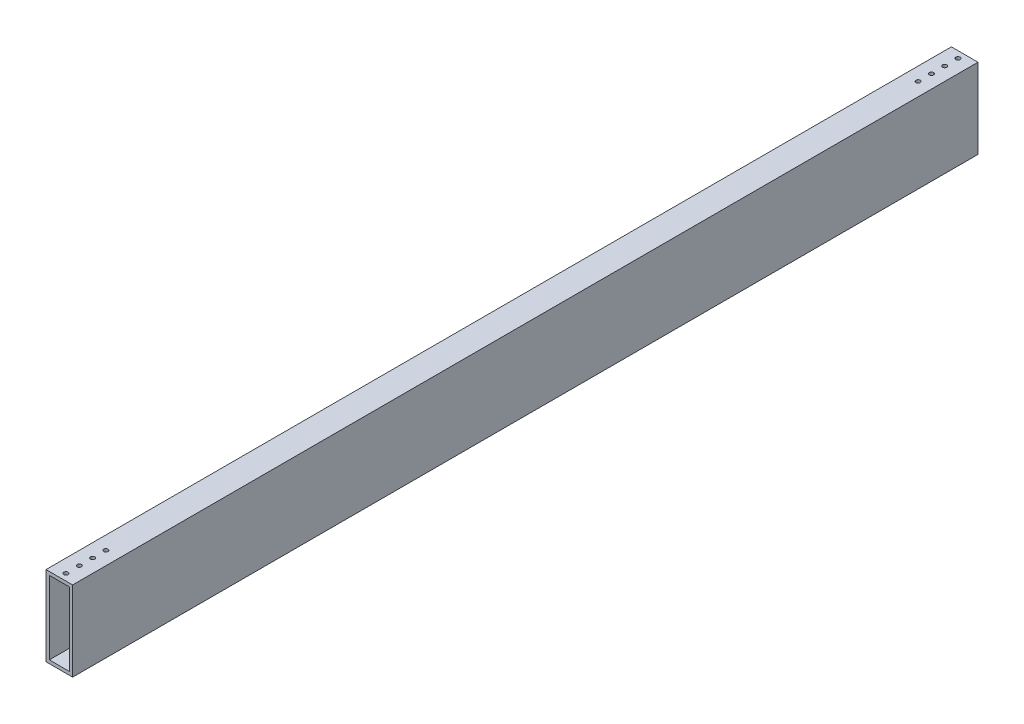
ISO-10303-21;
HEADER;
FILE_DESCRIPTION(('STEP AP214'),'2;1');
FILE_NAME('part.step','',(''),(''),'','','');
FILE_SCHEMA(('AUTOMOTIVE_DESIGN { 1 0 10303 214 1 1 1 1 }'));
ENDSEC;
DATA;
#1=APPLICATION_CONTEXT('core data for automotive mechanical design processes');
#2=APPLICATION_PROTOCOL_DEFINITION('international standard','automotive_design',2000,#1);
#3=PRODUCT_CONTEXT('',#1,'mechanical');
#4=PRODUCT('Part','Part','',(#3));
#5=PRODUCT_RELATED_PRODUCT_CATEGORY('part','',(#4));
#6=PRODUCT_DEFINITION_FORMATION('','',#4);
#7=PRODUCT_DEFINITION_CONTEXT('part definition',#1,'design');
#8=PRODUCT_DEFINITION('design','',#6,#7);
#9=PRODUCT_DEFINITION_SHAPE('','',#8);
#10=(LENGTH_UNIT() NAMED_UNIT(*) SI_UNIT(.MILLI.,.METRE.));
#11=(NAMED_UNIT(*) PLANE_ANGLE_UNIT() SI_UNIT($,.RADIAN.));
#12=(NAMED_UNIT(*) SI_UNIT($,.STERADIAN.) SOLID_ANGLE_UNIT());
#13=UNCERTAINTY_MEASURE_WITH_UNIT(LENGTH_MEASURE(1.E-05),#10,'distance_accuracy_value','');
#14=(GEOMETRIC_REPRESENTATION_CONTEXT(3) GLOBAL_UNCERTAINTY_ASSIGNED_CONTEXT((#13)) GLOBAL_UNIT_ASSIGNED_CONTEXT((#10,
#11,#12)) REPRESENTATION_CONTEXT('',''));
#15=CARTESIAN_POINT('',(0.,0.,0.));
#16=DIRECTION('',(0.,0.,1.));
#17=DIRECTION('',(1.,0.,0.));
#18=AXIS2_PLACEMENT_3D('',#15,#16,#17);
#19=CARTESIAN_POINT('',(3.9907631702977E-13,33.02,387.35));
#20=DIRECTION('',(0.,1.,0.));
#21=DIRECTION('',(0.,0.,1.));
#22=AXIS2_PLACEMENT_3D('',#19,#20,#21);
#23=CYLINDRICAL_SURFACE('',#22,2.0193);
#24=CARTESIAN_POINT('',(3.9907631702977E-13,34.925,387.35));
#25=DIRECTION('',(0.,1.,0.));
#26=DIRECTION('',(0.,0.,1.));
#27=AXIS2_PLACEMENT_3D('',#24,#25,#26);
#28=CIRCLE('',#27,2.0193);
#29=CARTESIAN_POINT('',(3.9907631702977E-13,34.925,389.3693));
#30=VERTEX_POINT('',#29);
#31=EDGE_CURVE('E20',#30,#30,#28,.T.);
#32=ORIENTED_EDGE('',*,*,#31,.F.);
#33=EDGE_LOOP('',(#32));
#34=FACE_BOUND('',#33,.T.);
#35=CARTESIAN_POINT('',(3.9907631702977E-13,38.1,387.35));
#36=DIRECTION('',(0.,1.,0.));
#37=DIRECTION('',(0.,0.,1.));
#38=AXIS2_PLACEMENT_3D('',#35,#36,#37);
#39=CIRCLE('',#38,2.0193);
#40=CARTESIAN_POINT('',(3.9907631702977E-13,38.1,389.3693));
#41=VERTEX_POINT('',#40);
#42=EDGE_CURVE('E117',#41,#41,#39,.T.);
#43=ORIENTED_EDGE('',*,*,#42,.T.);
#44=EDGE_LOOP('',(#43));
#45=FACE_BOUND('',#44,.T.);
#46=ADVANCED_FACE('F17',(#34,#45),#23,.F.);
#47=CARTESIAN_POINT('',(2.66050878019847E-13,33.02,400.05));
#48=DIRECTION('',(0.,1.,0.));
#49=DIRECTION('',(0.,0.,1.));
#50=AXIS2_PLACEMENT_3D('',#47,#48,#49);
#51=CYLINDRICAL_SURFACE('',#50,2.0193);
#52=CARTESIAN_POINT('',(2.66050878019847E-13,34.925,400.05));
#53=DIRECTION('',(0.,1.,0.));
#54=DIRECTION('',(0.,0.,1.));
#55=AXIS2_PLACEMENT_3D('',#52,#53,#54);
#56=CIRCLE('',#55,2.0193);
#57=CARTESIAN_POINT('',(2.66050878019847E-13,34.925,402.0693));
#58=VERTEX_POINT('',#57);
#59=EDGE_CURVE('E161',#58,#58,#56,.T.);
#60=ORIENTED_EDGE('',*,*,#59,.F.);
#61=EDGE_LOOP('',(#60));
#62=FACE_BOUND('',#61,.T.);
#63=CARTESIAN_POINT('',(2.66050878019847E-13,38.1,400.05));
#64=DIRECTION('',(0.,1.,0.));
#65=DIRECTION('',(0.,0.,1.));
#66=AXIS2_PLACEMENT_3D('',#63,#64,#65);
#67=CIRCLE('',#66,2.0193);
#68=CARTESIAN_POINT('',(2.66050878019847E-13,38.1,402.0693));
#69=VERTEX_POINT('',#68);
#70=EDGE_CURVE('E140',#69,#69,#67,.T.);
#71=ORIENTED_EDGE('',*,*,#70,.T.);
#72=EDGE_LOOP('',(#71));
#73=FACE_BOUND('',#72,.T.);
#74=ADVANCED_FACE('F171',(#62,#73),#51,.F.);
#75=CARTESIAN_POINT('',(1.33025439009923E-13,33.02,412.75));
#76=DIRECTION('',(0.,1.,0.));
#77=DIRECTION('',(0.,0.,1.));
#78=AXIS2_PLACEMENT_3D('',#75,#76,#77);
#79=CYLINDRICAL_SURFACE('',#78,2.0193);
#80=CARTESIAN_POINT('',(1.33025439009923E-13,34.925,412.75));
#81=DIRECTION('',(0.,1.,0.));
#82=DIRECTION('',(0.,0.,1.));
#83=AXIS2_PLACEMENT_3D('',#80,#81,#82);
#84=CIRCLE('',#83,2.0193);
#85=CARTESIAN_POINT('',(1.33025439009923E-13,34.925,414.7693));
#86=VERTEX_POINT('',#85);
#87=EDGE_CURVE('E159',#86,#86,#84,.T.);
#88=ORIENTED_EDGE('',*,*,#87,.F.);
#89=EDGE_LOOP('',(#88));
#90=FACE_BOUND('',#89,.T.);
#91=CARTESIAN_POINT('',(1.33025439009923E-13,38.1,412.75));
#92=DIRECTION('',(0.,1.,0.));
#93=DIRECTION('',(0.,0.,1.));
#94=AXIS2_PLACEMENT_3D('',#91,#92,#93);
#95=CIRCLE('',#94,2.0193);
#96=CARTESIAN_POINT('',(1.33025439009923E-13,38.1,414.7693));
#97=VERTEX_POINT('',#96);
#98=EDGE_CURVE('E137',#97,#97,#95,.T.);
#99=ORIENTED_EDGE('',*,*,#98,.T.);
#100=EDGE_LOOP('',(#99));
#101=FACE_BOUND('',#100,.T.);
#102=ADVANCED_FACE('F272',(#90,#101),#79,.F.);
#103=CARTESIAN_POINT('',(0.,33.02,425.45));
#104=DIRECTION('',(0.,1.,0.));
#105=DIRECTION('',(0.,0.,1.));
#106=AXIS2_PLACEMENT_3D('',#103,#104,#105);
#107=CYLINDRICAL_SURFACE('',#106,2.0193);
#108=CARTESIAN_POINT('',(0.,34.925,425.45));
#109=DIRECTION('',(0.,1.,0.));
#110=DIRECTION('',(0.,0.,1.));
#111=AXIS2_PLACEMENT_3D('',#108,#109,#110);
#112=CIRCLE('',#111,2.0193);
#113=CARTESIAN_POINT('',(0.,34.925,427.4693));
#114=VERTEX_POINT('',#113);
#115=EDGE_CURVE('E156',#114,#114,#112,.T.);
#116=ORIENTED_EDGE('',*,*,#115,.F.);
#117=EDGE_LOOP('',(#116));
#118=FACE_BOUND('',#117,.T.);
#119=CARTESIAN_POINT('',(0.,38.1,425.45));
#120=DIRECTION('',(0.,1.,0.));
#121=DIRECTION('',(0.,0.,1.));
#122=AXIS2_PLACEMENT_3D('',#119,#120,#121);
#123=CIRCLE('',#122,2.0193);
#124=CARTESIAN_POINT('',(0.,38.1,427.4693));
#125=VERTEX_POINT('',#124);
#126=EDGE_CURVE('E134',#125,#125,#123,.T.);
#127=ORIENTED_EDGE('',*,*,#126,.T.);
#128=EDGE_LOOP('',(#127));
#129=FACE_BOUND('',#128,.T.);
#130=ADVANCED_FACE('F268',(#118,#129),#107,.F.);
#131=CARTESIAN_POINT('',(3.9907631702977E-13,33.02,-387.35));
#132=DIRECTION('',(0.,1.,0.));
#133=DIRECTION('',(0.,0.,1.));
#134=AXIS2_PLACEMENT_3D('',#131,#132,#133);
#135=CYLINDRICAL_SURFACE('',#134,2.0193);
#136=CARTESIAN_POINT('',(3.9907631702977E-13,34.925,-387.35));
#137=DIRECTION('',(0.,1.,0.));
#138=DIRECTION('',(0.,0.,1.));
#139=AXIS2_PLACEMENT_3D('',#136,#137,#138);
#140=CIRCLE('',#139,2.0193);
#141=CARTESIAN_POINT('',(3.9907631702977E-13,34.925,-385.3307));
#142=VERTEX_POINT('',#141);
#143=EDGE_CURVE('E153',#142,#142,#140,.T.);
#144=ORIENTED_EDGE('',*,*,#143,.F.);
#145=EDGE_LOOP('',(#144));
#146=FACE_BOUND('',#145,.T.);
#147=CARTESIAN_POINT('',(3.9907631702977E-13,38.1,-387.35));
#148=DIRECTION('',(0.,1.,0.));
#149=DIRECTION('',(0.,0.,1.));
#150=AXIS2_PLACEMENT_3D('',#147,#148,#149);
#151=CIRCLE('',#150,2.0193);
#152=CARTESIAN_POINT('',(3.9907631702977E-13,38.1,-385.3307));
#153=VERTEX_POINT('',#152);
#154=EDGE_CURVE('E131',#153,#153,#151,.T.);
#155=ORIENTED_EDGE('',*,*,#154,.T.);
#156=EDGE_LOOP('',(#155));
#157=FACE_BOUND('',#156,.T.);
#158=ADVANCED_FACE('F264',(#146,#157),#135,.F.);
#159=CARTESIAN_POINT('',(2.66050878019847E-13,33.02,-400.05));
#160=DIRECTION('',(0.,1.,0.));
#161=DIRECTION('',(0.,0.,1.));
#162=AXIS2_PLACEMENT_3D('',#159,#160,#161);
#163=CYLINDRICAL_SURFACE('',#162,2.0193);
#164=CARTESIAN_POINT('',(2.66050878019847E-13,34.925,-400.05));
#165=DIRECTION('',(0.,1.,0.));
#166=DIRECTION('',(0.,0.,1.));
#167=AXIS2_PLACEMENT_3D('',#164,#165,#166);
#168=CIRCLE('',#167,2.0193);
#169=CARTESIAN_POINT('',(2.66050878019847E-13,34.925,-398.0307));
#170=VERTEX_POINT('',#169);
#171=EDGE_CURVE('E150',#170,#170,#168,.T.);
#172=ORIENTED_EDGE('',*,*,#171,.F.);
#173=EDGE_LOOP('',(#172));
#174=FACE_BOUND('',#173,.T.);
#175=CARTESIAN_POINT('',(2.66050878019847E-13,38.1,-400.05));
#176=DIRECTION('',(0.,1.,0.));
#177=DIRECTION('',(0.,0.,1.));
#178=AXIS2_PLACEMENT_3D('',#175,#176,#177);
#179=CIRCLE('',#178,2.0193);
#180=CARTESIAN_POINT('',(2.66050878019847E-13,38.1,-398.0307));
#181=VERTEX_POINT('',#180);
#182=EDGE_CURVE('E128',#181,#181,#179,.T.);
#183=ORIENTED_EDGE('',*,*,#182,.T.);
#184=EDGE_LOOP('',(#183));
#185=FACE_BOUND('',#184,.T.);
#186=ADVANCED_FACE('F260',(#174,#185),#163,.F.);
#187=CARTESIAN_POINT('',(1.33025439009923E-13,33.02,-412.75));
#188=DIRECTION('',(0.,1.,0.));
#189=DIRECTION('',(0.,0.,1.));
#190=AXIS2_PLACEMENT_3D('',#187,#188,#189);
#191=CYLINDRICAL_SURFACE('',#190,2.0193);
#192=CARTESIAN_POINT('',(1.33025439009923E-13,34.925,-412.75));
#193=DIRECTION('',(0.,1.,0.));
#194=DIRECTION('',(0.,0.,1.));
#195=AXIS2_PLACEMENT_3D('',#192,#193,#194);
#196=CIRCLE('',#195,2.0193);
#197=CARTESIAN_POINT('',(1.33025439009923E-13,34.925,-410.7307));
#198=VERTEX_POINT('',#197);
#199=EDGE_CURVE('E147',#198,#198,#196,.T.);
#200=ORIENTED_EDGE('',*,*,#199,.F.);
#201=EDGE_LOOP('',(#200));
#202=FACE_BOUND('',#201,.T.);
#203=CARTESIAN_POINT('',(1.33025439009923E-13,38.1,-412.75));
#204=DIRECTION('',(0.,1.,0.));
#205=DIRECTION('',(0.,0.,1.));
#206=AXIS2_PLACEMENT_3D('',#203,#204,#205);
#207=CIRCLE('',#206,2.0193);
#208=CARTESIAN_POINT('',(1.33025439009923E-13,38.1,-410.7307));
#209=VERTEX_POINT('',#208);
#210=EDGE_CURVE('E125',#209,#209,#207,.T.);
#211=ORIENTED_EDGE('',*,*,#210,.T.);
#212=EDGE_LOOP('',(#211));
#213=FACE_BOUND('',#212,.T.);
#214=ADVANCED_FACE('F253',(#202,#213),#191,.F.);
#215=CARTESIAN_POINT('',(0.,33.02,-425.45));
#216=DIRECTION('',(0.,1.,0.));
#217=DIRECTION('',(0.,0.,1.));
#218=AXIS2_PLACEMENT_3D('',#215,#216,#217);
#219=CYLINDRICAL_SURFACE('',#218,2.0193);
#220=CARTESIAN_POINT('',(0.,34.925,-425.45));
#221=DIRECTION('',(0.,1.,0.));
#222=DIRECTION('',(0.,0.,1.));
#223=AXIS2_PLACEMENT_3D('',#220,#221,#222);
#224=CIRCLE('',#223,2.0193);
#225=CARTESIAN_POINT('',(0.,34.925,-423.4307));
#226=VERTEX_POINT('',#225);
#227=EDGE_CURVE('E120',#226,#226,#224,.T.);
#228=ORIENTED_EDGE('',*,*,#227,.F.);
#229=EDGE_LOOP('',(#228));
#230=FACE_BOUND('',#229,.T.);
#231=CARTESIAN_POINT('',(0.,38.1,-425.45));
#232=DIRECTION('',(0.,1.,0.));
#233=DIRECTION('',(0.,0.,1.));
#234=AXIS2_PLACEMENT_3D('',#231,#232,#233);
#235=CIRCLE('',#234,2.0193);
#236=CARTESIAN_POINT('',(0.,38.1,-423.4307));
#237=VERTEX_POINT('',#236);
#238=EDGE_CURVE('E116',#237,#237,#235,.T.);
#239=ORIENTED_EDGE('',*,*,#238,.T.);
#240=EDGE_LOOP('',(#239));
#241=FACE_BOUND('',#240,.T.);
#242=ADVANCED_FACE('F245',(#230,#241),#219,.F.);
#243=CARTESIAN_POINT('',(12.7,38.1,431.8));
#244=DIRECTION('',(-1.,0.,0.));
#245=DIRECTION('',(0.,-1.,0.));
#246=AXIS2_PLACEMENT_3D('',#243,#244,#245);
#247=PLANE('',#246);
#248=DIRECTION('',(0.,0.,-1.));
#249=VECTOR('',#248,1.);
#250=CARTESIAN_POINT('',(12.7,38.1,431.8));
#251=LINE('',#250,#249);
#252=CARTESIAN_POINT('',(12.7,38.1,-431.8));
#253=VERTEX_POINT('',#252);
#254=CARTESIAN_POINT('',(12.7,38.1,431.8));
#255=VERTEX_POINT('',#254);
#256=EDGE_CURVE('E113',#253,#255,#251,.F.);
#257=ORIENTED_EDGE('',*,*,#256,.T.);
#258=DIRECTION('',(0.,1.,0.));
#259=VECTOR('',#258,1.);
#260=CARTESIAN_POINT('',(12.7,0.,431.8));
#261=LINE('',#260,#259);
#262=CARTESIAN_POINT('',(12.7,-38.1,431.8));
#263=VERTEX_POINT('',#262);
#264=EDGE_CURVE('E105',#255,#263,#261,.F.);
#265=ORIENTED_EDGE('',*,*,#264,.T.);
#266=DIRECTION('',(0.,0.,1.));
#267=VECTOR('',#266,1.);
#268=CARTESIAN_POINT('',(12.7,-38.1,431.8));
#269=LINE('',#268,#267);
#270=CARTESIAN_POINT('',(12.7,-38.1,-431.8));
#271=VERTEX_POINT('',#270);
#272=EDGE_CURVE('E206',#263,#271,#269,.F.);
#273=ORIENTED_EDGE('',*,*,#272,.T.);
#274=DIRECTION('',(0.,1.,0.));
#275=VECTOR('',#274,1.);
#276=CARTESIAN_POINT('',(12.7,0.,-431.8));
#277=LINE('',#276,#275);
#278=EDGE_CURVE('E239',#253,#271,#277,.F.);
#279=ORIENTED_EDGE('',*,*,#278,.F.);
#280=EDGE_LOOP('',(#257,#265,#273,#279));
#281=FACE_BOUND('',#280,.T.);
#282=ADVANCED_FACE('F242',(#281),#247,.F.);
#283=CARTESIAN_POINT('',(9.525,-34.925,431.8));
#284=DIRECTION('',(0.,1.,0.));
#285=DIRECTION('',(0.,0.,1.));
#286=AXIS2_PLACEMENT_3D('',#283,#284,#285);
#287=PLANE('',#286);
#288=DIRECTION('',(-1.,0.,0.));
#289=VECTOR('',#288,1.);
#290=CARTESIAN_POINT('',(0.,-34.925,431.8));
#291=LINE('',#290,#289);
#292=CARTESIAN_POINT('',(-9.525,-34.925,431.8));
#293=VERTEX_POINT('',#292);
#294=CARTESIAN_POINT('',(9.525,-34.925,431.8));
#295=VERTEX_POINT('',#294);
#296=EDGE_CURVE('E100',#293,#295,#291,.F.);
#297=ORIENTED_EDGE('',*,*,#296,.T.);
#298=DIRECTION('',(0.,0.,1.));
#299=VECTOR('',#298,1.);
#300=CARTESIAN_POINT('',(9.525,-34.925,431.8));
#301=LINE('',#300,#299);
#302=CARTESIAN_POINT('',(9.525,-34.925,-431.8));
#303=VERTEX_POINT('',#302);
#304=EDGE_CURVE('E121',#303,#295,#301,.T.);
#305=ORIENTED_EDGE('',*,*,#304,.F.);
#306=DIRECTION('',(-1.,0.,0.));
#307=VECTOR('',#306,1.);
#308=CARTESIAN_POINT('',(0.,-34.925,-431.8));
#309=LINE('',#308,#307);
#310=CARTESIAN_POINT('',(-9.525,-34.925,-431.8));
#311=VERTEX_POINT('',#310);
#312=EDGE_CURVE('E227',#311,#303,#309,.F.);
#313=ORIENTED_EDGE('',*,*,#312,.F.);
#314=DIRECTION('',(0.,0.,1.));
#315=VECTOR('',#314,1.);
#316=CARTESIAN_POINT('',(-9.525,-34.925,431.8));
#317=LINE('',#316,#315);
#318=EDGE_CURVE('E88',#293,#311,#317,.F.);
#319=ORIENTED_EDGE('',*,*,#318,.F.);
#320=EDGE_LOOP('',(#297,#305,#313,#319));
#321=FACE_BOUND('',#320,.T.);
#322=ADVANCED_FACE('F224',(#321),#287,.T.);
#323=CARTESIAN_POINT('',(9.52499999999999,34.925,431.8));
#324=DIRECTION('',(-1.,0.,0.));
#325=DIRECTION('',(0.,-1.,0.));
#326=AXIS2_PLACEMENT_3D('',#323,#324,#325);
#327=PLANE('',#326);
#328=DIRECTION('',(0.,1.,0.));
#329=VECTOR('',#328,1.);
#330=CARTESIAN_POINT('',(9.525,0.,431.8));
#331=LINE('',#330,#329);
#332=CARTESIAN_POINT('',(9.52499999999999,34.925,431.8));
#333=VERTEX_POINT('',#332);
#334=EDGE_CURVE('E218',#295,#333,#331,.T.);
#335=ORIENTED_EDGE('',*,*,#334,.T.);
#336=DIRECTION('',(0.,0.,-1.));
#337=VECTOR('',#336,1.);
#338=CARTESIAN_POINT('',(9.52499999999999,34.925,431.8));
#339=LINE('',#338,#337);
#340=CARTESIAN_POINT('',(9.52499999999999,34.925,-431.8));
#341=VERTEX_POINT('',#340);
#342=EDGE_CURVE('E89',#341,#333,#339,.F.);
#343=ORIENTED_EDGE('',*,*,#342,.F.);
#344=DIRECTION('',(0.,1.,0.));
#345=VECTOR('',#344,1.);
#346=CARTESIAN_POINT('',(9.525,0.,-431.8));
#347=LINE('',#346,#345);
#348=EDGE_CURVE('E232',#303,#341,#347,.T.);
#349=ORIENTED_EDGE('',*,*,#348,.F.);
#350=ORIENTED_EDGE('',*,*,#304,.T.);
#351=EDGE_LOOP('',(#335,#343,#349,#350));
#352=FACE_BOUND('',#351,.T.);
#353=ADVANCED_FACE('F251',(#352),#327,.T.);
#354=CARTESIAN_POINT('',(9.52499999999999,34.925,431.8));
#355=DIRECTION('',(0.,-1.,0.));
#356=DIRECTION('',(0.,0.,-1.));
#357=AXIS2_PLACEMENT_3D('',#354,#355,#356);
#358=PLANE('',#357);
#359=DIRECTION('',(-1.,0.,0.));
#360=VECTOR('',#359,1.);
#361=CARTESIAN_POINT('',(0.,34.925,431.8));
#362=LINE('',#361,#360);
#363=CARTESIAN_POINT('',(-9.52500000000001,34.925,431.8));
#364=VERTEX_POINT('',#363);
#365=EDGE_CURVE('E97',#333,#364,#362,.T.);
#366=ORIENTED_EDGE('',*,*,#365,.T.);
#367=DIRECTION('',(0.,0.,1.));
#368=VECTOR('',#367,1.);
#369=CARTESIAN_POINT('',(-9.52500000000001,34.925,431.8));
#370=LINE('',#369,#368);
#371=CARTESIAN_POINT('',(-9.52500000000001,34.925,-431.8));
#372=VERTEX_POINT('',#371);
#373=EDGE_CURVE('E79',#372,#364,#370,.T.);
#374=ORIENTED_EDGE('',*,*,#373,.F.);
#375=DIRECTION('',(-1.,0.,0.));
#376=VECTOR('',#375,1.);
#377=CARTESIAN_POINT('',(0.,34.925,-431.8));
#378=LINE('',#377,#376);
#379=EDGE_CURVE('E228',#341,#372,#378,.T.);
#380=ORIENTED_EDGE('',*,*,#379,.F.);
#381=ORIENTED_EDGE('',*,*,#342,.T.);
#382=EDGE_LOOP('',(#366,#374,#380,#381));
#383=FACE_BOUND('',#382,.T.);
#384=ORIENTED_EDGE('',*,*,#227,.T.);
#385=EDGE_LOOP('',(#384));
#386=FACE_BOUND('',#385,.T.);
#387=ORIENTED_EDGE('',*,*,#199,.T.);
#388=EDGE_LOOP('',(#387));
#389=FACE_BOUND('',#388,.T.);
#390=ORIENTED_EDGE('',*,*,#171,.T.);
#391=EDGE_LOOP('',(#390));
#392=FACE_BOUND('',#391,.T.);
#393=ORIENTED_EDGE('',*,*,#143,.T.);
#394=EDGE_LOOP('',(#393));
#395=FACE_BOUND('',#394,.T.);
#396=ORIENTED_EDGE('',*,*,#115,.T.);
#397=EDGE_LOOP('',(#396));
#398=FACE_BOUND('',#397,.T.);
#399=ORIENTED_EDGE('',*,*,#87,.T.);
#400=EDGE_LOOP('',(#399));
#401=FACE_BOUND('',#400,.T.);
#402=ORIENTED_EDGE('',*,*,#59,.T.);
#403=EDGE_LOOP('',(#402));
#404=FACE_BOUND('',#403,.T.);
#405=ORIENTED_EDGE('',*,*,#31,.T.);
#406=EDGE_LOOP('',(#405));
#407=FACE_BOUND('',#406,.T.);
#408=ADVANCED_FACE('F102',(#383,#386,#389,#392,#395,#398,#401,#404,#407),#358,.T.);
#409=CARTESIAN_POINT('',(-9.52500000000001,34.925,431.8));
#410=DIRECTION('',(1.,0.,0.));
#411=DIRECTION('',(0.,1.,0.));
#412=AXIS2_PLACEMENT_3D('',#409,#410,#411);
#413=PLANE('',#412);
#414=DIRECTION('',(0.,1.,0.));
#415=VECTOR('',#414,1.);
#416=CARTESIAN_POINT('',(-9.52500000000001,0.,431.8));
#417=LINE('',#416,#415);
#418=EDGE_CURVE('E82',#364,#293,#417,.F.);
#419=ORIENTED_EDGE('',*,*,#418,.T.);
#420=ORIENTED_EDGE('',*,*,#318,.T.);
#421=DIRECTION('',(0.,1.,0.));
#422=VECTOR('',#421,1.);
#423=CARTESIAN_POINT('',(-9.52500000000001,0.,-431.8));
#424=LINE('',#423,#422);
#425=EDGE_CURVE('E84',#372,#311,#424,.F.);
#426=ORIENTED_EDGE('',*,*,#425,.F.);
#427=ORIENTED_EDGE('',*,*,#373,.T.);
#428=EDGE_LOOP('',(#419,#420,#426,#427));
#429=FACE_BOUND('',#428,.T.);
#430=ADVANCED_FACE('F81',(#429),#413,.T.);
#431=CARTESIAN_POINT('',(12.7,38.1,431.8));
#432=DIRECTION('',(0.,-1.,0.));
#433=DIRECTION('',(0.,0.,-1.));
#434=AXIS2_PLACEMENT_3D('',#431,#432,#433);
#435=PLANE('',#434);
#436=DIRECTION('',(0.,0.,1.));
#437=VECTOR('',#436,1.);
#438=CARTESIAN_POINT('',(-12.7,38.1,431.8));
#439=LINE('',#438,#437);
#440=CARTESIAN_POINT('',(-12.7,38.1,-431.8));
#441=VERTEX_POINT('',#440);
#442=CARTESIAN_POINT('',(-12.7,38.1,431.8));
#443=VERTEX_POINT('',#442);
#444=EDGE_CURVE('E229',#441,#443,#439,.T.);
#445=ORIENTED_EDGE('',*,*,#444,.T.);
#446=DIRECTION('',(-1.,0.,0.));
#447=VECTOR('',#446,1.);
#448=CARTESIAN_POINT('',(0.,38.1,431.8));
#449=LINE('',#448,#447);
#450=EDGE_CURVE('E107',#443,#255,#449,.F.);
#451=ORIENTED_EDGE('',*,*,#450,.T.);
#452=ORIENTED_EDGE('',*,*,#256,.F.);
#453=DIRECTION('',(-1.,0.,0.));
#454=VECTOR('',#453,1.);
#455=CARTESIAN_POINT('',(0.,38.1,-431.8));
#456=LINE('',#455,#454);
#457=EDGE_CURVE('E212',#441,#253,#456,.F.);
#458=ORIENTED_EDGE('',*,*,#457,.F.);
#459=EDGE_LOOP('',(#445,#451,#452,#458));
#460=FACE_BOUND('',#459,.T.);
#461=ORIENTED_EDGE('',*,*,#238,.F.);
#462=EDGE_LOOP('',(#461));
#463=FACE_BOUND('',#462,.T.);
#464=ORIENTED_EDGE('',*,*,#210,.F.);
#465=EDGE_LOOP('',(#464));
#466=FACE_BOUND('',#465,.T.);
#467=ORIENTED_EDGE('',*,*,#182,.F.);
#468=EDGE_LOOP('',(#467));
#469=FACE_BOUND('',#468,.T.);
#470=ORIENTED_EDGE('',*,*,#154,.F.);
#471=EDGE_LOOP('',(#470));
#472=FACE_BOUND('',#471,.T.);
#473=ORIENTED_EDGE('',*,*,#126,.F.);
#474=EDGE_LOOP('',(#473));
#475=FACE_BOUND('',#474,.T.);
#476=ORIENTED_EDGE('',*,*,#98,.F.);
#477=EDGE_LOOP('',(#476));
#478=FACE_BOUND('',#477,.T.);
#479=ORIENTED_EDGE('',*,*,#70,.F.);
#480=EDGE_LOOP('',(#479));
#481=FACE_BOUND('',#480,.T.);
#482=ORIENTED_EDGE('',*,*,#42,.F.);
#483=EDGE_LOOP('',(#482));
#484=FACE_BOUND('',#483,.T.);
#485=ADVANCED_FACE('F174',(#460,#463,#466,#469,#472,#475,#478,#481,#484),#435,.F.);
#486=CARTESIAN_POINT('',(0.,0.,431.8));
#487=DIRECTION('',(0.,0.,-1.));
#488=DIRECTION('',(-1.,0.,0.));
#489=AXIS2_PLACEMENT_3D('',#486,#487,#488);
#490=PLANE('',#489);
#491=ORIENTED_EDGE('',*,*,#296,.F.);
#492=ORIENTED_EDGE('',*,*,#418,.F.);
#493=ORIENTED_EDGE('',*,*,#365,.F.);
#494=ORIENTED_EDGE('',*,*,#334,.F.);
#495=EDGE_LOOP('',(#491,#492,#493,#494));
#496=FACE_BOUND('',#495,.T.);
#497=DIRECTION('',(1.,0.,0.));
#498=VECTOR('',#497,1.);
#499=CARTESIAN_POINT('',(12.7,-38.1,431.8));
#500=LINE('',#499,#498);
#501=CARTESIAN_POINT('',(-12.7,-38.1,431.8));
#502=VERTEX_POINT('',#501);
#503=EDGE_CURVE('E209',#502,#263,#500,.T.);
#504=ORIENTED_EDGE('',*,*,#503,.T.);
#505=ORIENTED_EDGE('',*,*,#264,.F.);
#506=ORIENTED_EDGE('',*,*,#450,.F.);
#507=DIRECTION('',(0.,1.,0.));
#508=VECTOR('',#507,1.);
#509=CARTESIAN_POINT('',(-12.7,38.1,431.8));
#510=LINE('',#509,#508);
#511=EDGE_CURVE('E217',#443,#502,#510,.F.);
#512=ORIENTED_EDGE('',*,*,#511,.T.);
#513=EDGE_LOOP('',(#504,#505,#506,#512));
#514=FACE_BOUND('',#513,.T.);
#515=ADVANCED_FACE('F94',(#496,#514),#490,.F.);
#516=CARTESIAN_POINT('',(12.7,-38.1,431.8));
#517=DIRECTION('',(0.,1.,0.));
#518=DIRECTION('',(0.,0.,1.));
#519=AXIS2_PLACEMENT_3D('',#516,#517,#518);
#520=PLANE('',#519);
#521=ORIENTED_EDGE('',*,*,#272,.F.);
#522=ORIENTED_EDGE('',*,*,#503,.F.);
#523=DIRECTION('',(0.,0.,1.));
#524=VECTOR('',#523,1.);
#525=CARTESIAN_POINT('',(-12.7,-38.1,431.8));
#526=LINE('',#525,#524);
#527=CARTESIAN_POINT('',(-12.7,-38.1,-431.8));
#528=VERTEX_POINT('',#527);
#529=EDGE_CURVE('E26',#502,#528,#526,.F.);
#530=ORIENTED_EDGE('',*,*,#529,.T.);
#531=DIRECTION('',(-1.,0.,0.));
#532=VECTOR('',#531,1.);
#533=CARTESIAN_POINT('',(0.,-38.1,-431.8));
#534=LINE('',#533,#532);
#535=EDGE_CURVE('E34',#271,#528,#534,.T.);
#536=ORIENTED_EDGE('',*,*,#535,.F.);
#537=EDGE_LOOP('',(#521,#522,#530,#536));
#538=FACE_BOUND('',#537,.T.);
#539=ADVANCED_FACE('F183',(#538),#520,.F.);
#540=CARTESIAN_POINT('',(0.,0.,-431.8));
#541=DIRECTION('',(0.,0.,-1.));
#542=DIRECTION('',(-1.,0.,0.));
#543=AXIS2_PLACEMENT_3D('',#540,#541,#542);
#544=PLANE('',#543);
#545=ORIENTED_EDGE('',*,*,#379,.T.);
#546=ORIENTED_EDGE('',*,*,#425,.T.);
#547=ORIENTED_EDGE('',*,*,#312,.T.);
#548=ORIENTED_EDGE('',*,*,#348,.T.);
#549=EDGE_LOOP('',(#545,#546,#547,#548));
#550=FACE_BOUND('',#549,.T.);
#551=ORIENTED_EDGE('',*,*,#278,.T.);
#552=ORIENTED_EDGE('',*,*,#535,.T.);
#553=DIRECTION('',(0.,1.,0.));
#554=VECTOR('',#553,1.);
#555=CARTESIAN_POINT('',(-12.7,38.1,-431.8));
#556=LINE('',#555,#554);
#557=EDGE_CURVE('E11',#528,#441,#556,.T.);
#558=ORIENTED_EDGE('',*,*,#557,.T.);
#559=ORIENTED_EDGE('',*,*,#457,.T.);
#560=EDGE_LOOP('',(#551,#552,#558,#559));
#561=FACE_BOUND('',#560,.T.);
#562=ADVANCED_FACE('F190',(#550,#561),#544,.T.);
#563=CARTESIAN_POINT('',(-12.7,38.1,431.8));
#564=DIRECTION('',(1.,0.,0.));
#565=DIRECTION('',(0.,1.,0.));
#566=AXIS2_PLACEMENT_3D('',#563,#564,#565);
#567=PLANE('',#566);
#568=ORIENTED_EDGE('',*,*,#529,.F.);
#569=ORIENTED_EDGE('',*,*,#511,.F.);
#570=ORIENTED_EDGE('',*,*,#444,.F.);
#571=ORIENTED_EDGE('',*,*,#557,.F.);
#572=EDGE_LOOP('',(#568,#569,#570,#571));
#573=FACE_BOUND('',#572,.T.);
#574=ADVANCED_FACE('F188',(#573),#567,.F.);
#575=CLOSED_SHELL('',(#46,#74,#102,#130,#158,#186,#214,#242,#282,#322,#353,#408,#430,#485,#515,
#539,#562,#574));
#576=MANIFOLD_SOLID_BREP('B1',#575);
#577=ADVANCED_BREP_SHAPE_REPRESENTATION('',(#18,#576),#14);
#578=SHAPE_DEFINITION_REPRESENTATION(#9,#577);
ENDSEC;
END-ISO-10303-21;
